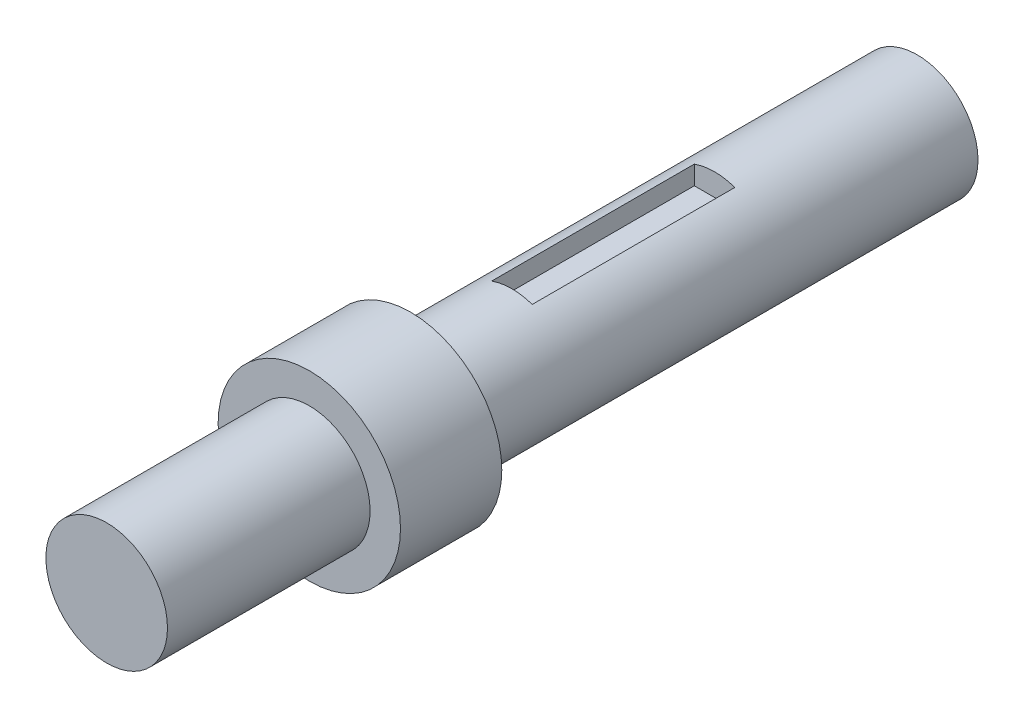
ISO-10303-21;
HEADER;
FILE_DESCRIPTION(('STEP AP214'),'2;1');
FILE_NAME('part.step','',(''),(''),'','','');
FILE_SCHEMA(('AUTOMOTIVE_DESIGN { 1 0 10303 214 1 1 1 1 }'));
ENDSEC;
DATA;
#1=APPLICATION_CONTEXT('core data for automotive mechanical design processes');
#2=APPLICATION_PROTOCOL_DEFINITION('international standard','automotive_design',2000,#1);
#3=PRODUCT_CONTEXT('',#1,'mechanical');
#4=PRODUCT('Part','Part','',(#3));
#5=PRODUCT_RELATED_PRODUCT_CATEGORY('part','',(#4));
#6=PRODUCT_DEFINITION_FORMATION('','',#4);
#7=PRODUCT_DEFINITION_CONTEXT('part definition',#1,'design');
#8=PRODUCT_DEFINITION('design','',#6,#7);
#9=PRODUCT_DEFINITION_SHAPE('','',#8);
#10=(LENGTH_UNIT() NAMED_UNIT(*) SI_UNIT(.MILLI.,.METRE.));
#11=(NAMED_UNIT(*) PLANE_ANGLE_UNIT() SI_UNIT($,.RADIAN.));
#12=(NAMED_UNIT(*) SI_UNIT($,.STERADIAN.) SOLID_ANGLE_UNIT());
#13=UNCERTAINTY_MEASURE_WITH_UNIT(LENGTH_MEASURE(1.E-05),#10,'distance_accuracy_value','');
#14=(GEOMETRIC_REPRESENTATION_CONTEXT(3) GLOBAL_UNCERTAINTY_ASSIGNED_CONTEXT((#13)) GLOBAL_UNIT_ASSIGNED_CONTEXT((#10,
#11,#12)) REPRESENTATION_CONTEXT('',''));
#15=CARTESIAN_POINT('',(0.,0.,0.));
#16=DIRECTION('',(0.,0.,1.));
#17=DIRECTION('',(1.,0.,0.));
#18=AXIS2_PLACEMENT_3D('',#15,#16,#17);
#19=CARTESIAN_POINT('',(0.,0.,50.));
#20=DIRECTION('',(0.,0.,-1.));
#21=DIRECTION('',(-1.,0.,0.));
#22=AXIS2_PLACEMENT_3D('',#19,#20,#21);
#23=CYLINDRICAL_SURFACE('',#22,6.);
#24=DIRECTION('',(0.,0.,-1.));
#25=VECTOR('',#24,1.);
#26=CARTESIAN_POINT('',(2.,5.65685424949238,50.));
#27=LINE('',#26,#25);
#28=CARTESIAN_POINT('',(2.,5.65685424949238,20.));
#29=VERTEX_POINT('',#28);
#30=CARTESIAN_POINT('',(2.,5.65685424949238,40.));
#31=VERTEX_POINT('',#30);
#32=EDGE_CURVE('E11',#29,#31,#27,.F.);
#33=ORIENTED_EDGE('',*,*,#32,.T.);
#34=CARTESIAN_POINT('',(0.,0.,40.));
#35=DIRECTION('',(0.,0.,1.));
#36=DIRECTION('',(1.,0.,0.));
#37=AXIS2_PLACEMENT_3D('',#34,#35,#36);
#38=CIRCLE('',#37,6.);
#39=CARTESIAN_POINT('',(-2.,5.65685424949238,40.));
#40=VERTEX_POINT('',#39);
#41=EDGE_CURVE('E113',#31,#40,#38,.T.);
#42=ORIENTED_EDGE('',*,*,#41,.T.);
#43=DIRECTION('',(0.,0.,-1.));
#44=VECTOR('',#43,1.);
#45=CARTESIAN_POINT('',(-2.,5.65685424949238,50.));
#46=LINE('',#45,#44);
#47=CARTESIAN_POINT('',(-2.,5.65685424949238,20.));
#48=VERTEX_POINT('',#47);
#49=EDGE_CURVE('E44',#40,#48,#46,.T.);
#50=ORIENTED_EDGE('',*,*,#49,.T.);
#51=CARTESIAN_POINT('',(0.,0.,20.));
#52=DIRECTION('',(0.,0.,-1.));
#53=DIRECTION('',(-1.,0.,0.));
#54=AXIS2_PLACEMENT_3D('',#51,#52,#53);
#55=CIRCLE('',#54,6.);
#56=EDGE_CURVE('E59',#48,#29,#55,.T.);
#57=ORIENTED_EDGE('',*,*,#56,.T.);
#58=EDGE_LOOP('',(#33,#42,#50,#57));
#59=FACE_BOUND('',#58,.T.);
#60=CARTESIAN_POINT('',(0.,0.,50.));
#61=DIRECTION('',(0.,0.,1.));
#62=DIRECTION('',(1.,0.,0.));
#63=AXIS2_PLACEMENT_3D('',#60,#61,#62);
#64=CIRCLE('',#63,6.);
#65=CARTESIAN_POINT('',(6.,0.,50.));
#66=VERTEX_POINT('',#65);
#67=EDGE_CURVE('E114',#66,#66,#64,.T.);
#68=ORIENTED_EDGE('',*,*,#67,.F.);
#69=EDGE_LOOP('',(#68));
#70=FACE_BOUND('',#69,.T.);
#71=CARTESIAN_POINT('',(0.,0.,0.));
#72=DIRECTION('',(0.,0.,1.));
#73=DIRECTION('',(1.,0.,0.));
#74=AXIS2_PLACEMENT_3D('',#71,#72,#73);
#75=CIRCLE('',#74,6.);
#76=CARTESIAN_POINT('',(6.,0.,0.));
#77=VERTEX_POINT('',#76);
#78=EDGE_CURVE('E118',#77,#77,#75,.T.);
#79=ORIENTED_EDGE('',*,*,#78,.T.);
#80=EDGE_LOOP('',(#79));
#81=FACE_BOUND('',#80,.T.);
#82=ADVANCED_FACE('F37',(#59,#70,#81),#23,.T.);
#83=CARTESIAN_POINT('',(0.,0.,0.));
#84=DIRECTION('',(0.,0.,1.));
#85=DIRECTION('',(1.,0.,0.));
#86=AXIS2_PLACEMENT_3D('',#83,#84,#85);
#87=PLANE('',#86);
#88=ORIENTED_EDGE('',*,*,#78,.F.);
#89=EDGE_LOOP('',(#88));
#90=FACE_BOUND('',#89,.T.);
#91=ADVANCED_FACE('F142',(#90),#87,.F.);
#92=CARTESIAN_POINT('',(0.,0.,60.));
#93=DIRECTION('',(0.,0.,-1.));
#94=DIRECTION('',(-1.,0.,0.));
#95=AXIS2_PLACEMENT_3D('',#92,#93,#94);
#96=CYLINDRICAL_SURFACE('',#95,9.);
#97=CARTESIAN_POINT('',(0.,0.,60.));
#98=DIRECTION('',(0.,0.,1.));
#99=DIRECTION('',(1.,0.,0.));
#100=AXIS2_PLACEMENT_3D('',#97,#98,#99);
#101=CIRCLE('',#100,9.);
#102=CARTESIAN_POINT('',(9.,0.,60.));
#103=VERTEX_POINT('',#102);
#104=EDGE_CURVE('E115',#103,#103,#101,.T.);
#105=ORIENTED_EDGE('',*,*,#104,.F.);
#106=EDGE_LOOP('',(#105));
#107=FACE_BOUND('',#106,.T.);
#108=CARTESIAN_POINT('',(0.,0.,50.));
#109=DIRECTION('',(0.,0.,1.));
#110=DIRECTION('',(1.,0.,0.));
#111=AXIS2_PLACEMENT_3D('',#108,#109,#110);
#112=CIRCLE('',#111,9.);
#113=CARTESIAN_POINT('',(9.,0.,50.));
#114=VERTEX_POINT('',#113);
#115=EDGE_CURVE('E109',#114,#114,#112,.T.);
#116=ORIENTED_EDGE('',*,*,#115,.T.);
#117=EDGE_LOOP('',(#116));
#118=FACE_BOUND('',#117,.T.);
#119=ADVANCED_FACE('F146',(#107,#118),#96,.T.);
#120=CARTESIAN_POINT('',(0.,0.,60.));
#121=DIRECTION('',(0.,0.,1.));
#122=DIRECTION('',(1.,0.,0.));
#123=AXIS2_PLACEMENT_3D('',#120,#121,#122);
#124=PLANE('',#123);
#125=CARTESIAN_POINT('',(0.,0.,60.));
#126=DIRECTION('',(0.,0.,1.));
#127=DIRECTION('',(1.,0.,0.));
#128=AXIS2_PLACEMENT_3D('',#125,#126,#127);
#129=CIRCLE('',#128,6.);
#130=CARTESIAN_POINT('',(6.,0.,60.));
#131=VERTEX_POINT('',#130);
#132=EDGE_CURVE('E110',#131,#131,#129,.T.);
#133=ORIENTED_EDGE('',*,*,#132,.F.);
#134=EDGE_LOOP('',(#133));
#135=FACE_BOUND('',#134,.T.);
#136=ORIENTED_EDGE('',*,*,#104,.T.);
#137=EDGE_LOOP('',(#136));
#138=FACE_BOUND('',#137,.T.);
#139=ADVANCED_FACE('F151',(#135,#138),#124,.T.);
#140=CARTESIAN_POINT('',(0.,0.,50.));
#141=DIRECTION('',(0.,0.,1.));
#142=DIRECTION('',(1.,0.,0.));
#143=AXIS2_PLACEMENT_3D('',#140,#141,#142);
#144=PLANE('',#143);
#145=ORIENTED_EDGE('',*,*,#67,.T.);
#146=EDGE_LOOP('',(#145));
#147=FACE_BOUND('',#146,.T.);
#148=ORIENTED_EDGE('',*,*,#115,.F.);
#149=EDGE_LOOP('',(#148));
#150=FACE_BOUND('',#149,.T.);
#151=ADVANCED_FACE('F156',(#147,#150),#144,.F.);
#152=CARTESIAN_POINT('',(0.,0.,80.));
#153=DIRECTION('',(0.,0.,-1.));
#154=DIRECTION('',(-1.,0.,0.));
#155=AXIS2_PLACEMENT_3D('',#152,#153,#154);
#156=CYLINDRICAL_SURFACE('',#155,6.);
#157=CARTESIAN_POINT('',(0.,0.,80.));
#158=DIRECTION('',(0.,0.,1.));
#159=DIRECTION('',(1.,0.,0.));
#160=AXIS2_PLACEMENT_3D('',#157,#158,#159);
#161=CIRCLE('',#160,6.);
#162=CARTESIAN_POINT('',(6.,0.,80.));
#163=VERTEX_POINT('',#162);
#164=EDGE_CURVE('E103',#163,#163,#161,.T.);
#165=ORIENTED_EDGE('',*,*,#164,.F.);
#166=EDGE_LOOP('',(#165));
#167=FACE_BOUND('',#166,.T.);
#168=ORIENTED_EDGE('',*,*,#132,.T.);
#169=EDGE_LOOP('',(#168));
#170=FACE_BOUND('',#169,.T.);
#171=ADVANCED_FACE('F159',(#167,#170),#156,.T.);
#172=CARTESIAN_POINT('',(0.,0.,80.));
#173=DIRECTION('',(0.,0.,1.));
#174=DIRECTION('',(1.,0.,0.));
#175=AXIS2_PLACEMENT_3D('',#172,#173,#174);
#176=PLANE('',#175);
#177=ORIENTED_EDGE('',*,*,#164,.T.);
#178=EDGE_LOOP('',(#177));
#179=FACE_BOUND('',#178,.T.);
#180=ADVANCED_FACE('F138',(#179),#176,.T.);
#181=CARTESIAN_POINT('',(-2.,3.8,40.));
#182=DIRECTION('',(-1.,0.,0.));
#183=DIRECTION('',(0.,0.,1.));
#184=AXIS2_PLACEMENT_3D('',#181,#182,#183);
#185=PLANE('',#184);
#186=DIRECTION('',(0.,1.,0.));
#187=VECTOR('',#186,1.);
#188=CARTESIAN_POINT('',(-2.,3.8,40.));
#189=LINE('',#188,#187);
#190=CARTESIAN_POINT('',(-2.,3.8,40.));
#191=VERTEX_POINT('',#190);
#192=EDGE_CURVE('E51',#191,#40,#189,.T.);
#193=ORIENTED_EDGE('',*,*,#192,.F.);
#194=DIRECTION('',(0.,0.,1.));
#195=VECTOR('',#194,1.);
#196=CARTESIAN_POINT('',(-2.,3.8,40.));
#197=LINE('',#196,#195);
#198=CARTESIAN_POINT('',(-2.,3.8,20.));
#199=VERTEX_POINT('',#198);
#200=EDGE_CURVE('E79',#199,#191,#197,.T.);
#201=ORIENTED_EDGE('',*,*,#200,.F.);
#202=DIRECTION('',(0.,1.,0.));
#203=VECTOR('',#202,1.);
#204=CARTESIAN_POINT('',(-2.,3.8,20.));
#205=LINE('',#204,#203);
#206=EDGE_CURVE('E101',#199,#48,#205,.T.);
#207=ORIENTED_EDGE('',*,*,#206,.T.);
#208=ORIENTED_EDGE('',*,*,#49,.F.);
#209=EDGE_LOOP('',(#193,#201,#207,#208));
#210=FACE_BOUND('',#209,.T.);
#211=ADVANCED_FACE('F77',(#210),#185,.F.);
#212=CARTESIAN_POINT('',(-2.,3.8,20.));
#213=DIRECTION('',(0.,0.,-1.));
#214=DIRECTION('',(-1.,0.,0.));
#215=AXIS2_PLACEMENT_3D('',#212,#213,#214);
#216=PLANE('',#215);
#217=ORIENTED_EDGE('',*,*,#206,.F.);
#218=DIRECTION('',(-1.,0.,0.));
#219=VECTOR('',#218,1.);
#220=CARTESIAN_POINT('',(-2.,3.8,20.));
#221=LINE('',#220,#219);
#222=CARTESIAN_POINT('',(2.,3.8,20.));
#223=VERTEX_POINT('',#222);
#224=EDGE_CURVE('E84',#223,#199,#221,.T.);
#225=ORIENTED_EDGE('',*,*,#224,.F.);
#226=DIRECTION('',(0.,1.,0.));
#227=VECTOR('',#226,1.);
#228=CARTESIAN_POINT('',(2.,3.8,20.));
#229=LINE('',#228,#227);
#230=EDGE_CURVE('E104',#223,#29,#229,.T.);
#231=ORIENTED_EDGE('',*,*,#230,.T.);
#232=ORIENTED_EDGE('',*,*,#56,.F.);
#233=EDGE_LOOP('',(#217,#225,#231,#232));
#234=FACE_BOUND('',#233,.T.);
#235=ADVANCED_FACE('F130',(#234),#216,.F.);
#236=CARTESIAN_POINT('',(2.,3.8,40.));
#237=DIRECTION('',(1.,0.,0.));
#238=DIRECTION('',(0.,0.,-1.));
#239=AXIS2_PLACEMENT_3D('',#236,#237,#238);
#240=PLANE('',#239);
#241=ORIENTED_EDGE('',*,*,#230,.F.);
#242=DIRECTION('',(0.,0.,-1.));
#243=VECTOR('',#242,1.);
#244=CARTESIAN_POINT('',(2.,3.8,40.));
#245=LINE('',#244,#243);
#246=CARTESIAN_POINT('',(2.,3.8,40.));
#247=VERTEX_POINT('',#246);
#248=EDGE_CURVE('E93',#247,#223,#245,.T.);
#249=ORIENTED_EDGE('',*,*,#248,.F.);
#250=DIRECTION('',(0.,1.,0.));
#251=VECTOR('',#250,1.);
#252=CARTESIAN_POINT('',(2.,3.8,40.));
#253=LINE('',#252,#251);
#254=EDGE_CURVE('E83',#247,#31,#253,.T.);
#255=ORIENTED_EDGE('',*,*,#254,.T.);
#256=ORIENTED_EDGE('',*,*,#32,.F.);
#257=EDGE_LOOP('',(#241,#249,#255,#256));
#258=FACE_BOUND('',#257,.T.);
#259=ADVANCED_FACE('F129',(#258),#240,.F.);
#260=CARTESIAN_POINT('',(-2.,3.8,40.));
#261=DIRECTION('',(0.,0.,1.));
#262=DIRECTION('',(1.,0.,0.));
#263=AXIS2_PLACEMENT_3D('',#260,#261,#262);
#264=PLANE('',#263);
#265=ORIENTED_EDGE('',*,*,#254,.F.);
#266=DIRECTION('',(1.,0.,0.));
#267=VECTOR('',#266,1.);
#268=CARTESIAN_POINT('',(-2.,3.8,40.));
#269=LINE('',#268,#267);
#270=EDGE_CURVE('E87',#191,#247,#269,.T.);
#271=ORIENTED_EDGE('',*,*,#270,.F.);
#272=ORIENTED_EDGE('',*,*,#192,.T.);
#273=ORIENTED_EDGE('',*,*,#41,.F.);
#274=EDGE_LOOP('',(#265,#271,#272,#273));
#275=FACE_BOUND('',#274,.T.);
#276=ADVANCED_FACE('F88',(#275),#264,.F.);
#277=CARTESIAN_POINT('',(0.,3.8,0.));
#278=DIRECTION('',(0.,-1.,0.));
#279=DIRECTION('',(0.,0.,-1.));
#280=AXIS2_PLACEMENT_3D('',#277,#278,#279);
#281=PLANE('',#280);
#282=ORIENTED_EDGE('',*,*,#200,.T.);
#283=ORIENTED_EDGE('',*,*,#270,.T.);
#284=ORIENTED_EDGE('',*,*,#248,.T.);
#285=ORIENTED_EDGE('',*,*,#224,.T.);
#286=EDGE_LOOP('',(#282,#283,#284,#285));
#287=FACE_BOUND('',#286,.T.);
#288=ADVANCED_FACE('F95',(#287),#281,.F.);
#289=CLOSED_SHELL('',(#82,#91,#119,#139,#151,#171,#180,#211,#235,#259,#276,#288));
#290=MANIFOLD_SOLID_BREP('B2',#289);
#291=ADVANCED_BREP_SHAPE_REPRESENTATION('',(#18,#290),#14);
#292=SHAPE_DEFINITION_REPRESENTATION(#9,#291);
ENDSEC;
END-ISO-10303-21;
